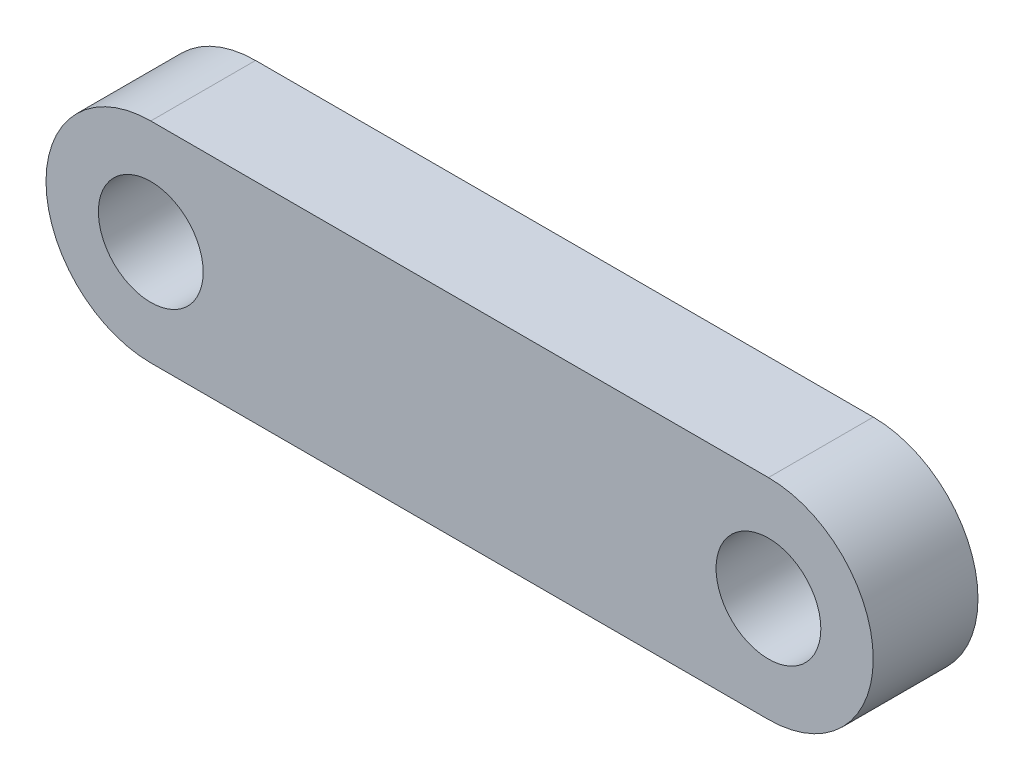
ISO-10303-21;
HEADER;
FILE_DESCRIPTION(('STEP AP214'),'2;1');
FILE_NAME('part.step','',(''),(''),'','','');
FILE_SCHEMA(('AUTOMOTIVE_DESIGN { 1 0 10303 214 1 1 1 1 }'));
ENDSEC;
DATA;
#1=APPLICATION_CONTEXT('core data for automotive mechanical design processes');
#2=APPLICATION_PROTOCOL_DEFINITION('international standard','automotive_design',2000,#1);
#3=PRODUCT_CONTEXT('',#1,'mechanical');
#4=PRODUCT('Part','Part','',(#3));
#5=PRODUCT_RELATED_PRODUCT_CATEGORY('part','',(#4));
#6=PRODUCT_DEFINITION_FORMATION('','',#4);
#7=PRODUCT_DEFINITION_CONTEXT('part definition',#1,'design');
#8=PRODUCT_DEFINITION('design','',#6,#7);
#9=PRODUCT_DEFINITION_SHAPE('','',#8);
#10=(LENGTH_UNIT() NAMED_UNIT(*) SI_UNIT(.MILLI.,.METRE.));
#11=(NAMED_UNIT(*) PLANE_ANGLE_UNIT() SI_UNIT($,.RADIAN.));
#12=(NAMED_UNIT(*) SI_UNIT($,.STERADIAN.) SOLID_ANGLE_UNIT());
#13=UNCERTAINTY_MEASURE_WITH_UNIT(LENGTH_MEASURE(1.E-05),#10,'distance_accuracy_value','');
#14=(GEOMETRIC_REPRESENTATION_CONTEXT(3) GLOBAL_UNCERTAINTY_ASSIGNED_CONTEXT((#13)) GLOBAL_UNIT_ASSIGNED_CONTEXT((#10,
#11,#12)) REPRESENTATION_CONTEXT('',''));
#15=CARTESIAN_POINT('',(0.,0.,0.));
#16=DIRECTION('',(0.,0.,1.));
#17=DIRECTION('',(1.,0.,0.));
#18=AXIS2_PLACEMENT_3D('',#15,#16,#17);
#19=CARTESIAN_POINT('',(-5.89499999215286,0.000304167366532138,2.));
#20=DIRECTION('',(0.,0.,1.));
#21=DIRECTION('',(1.,0.,0.));
#22=AXIS2_PLACEMENT_3D('',#19,#20,#21);
#23=PLANE('',#22);
#24=CARTESIAN_POINT('',(-5.89499999215286,0.000304167366532138,2.));
#25=DIRECTION('',(0.,0.,1.));
#26=DIRECTION('',(1.,0.,0.));
#27=AXIS2_PLACEMENT_3D('',#24,#25,#26);
#28=CIRCLE('',#27,1.);
#29=CARTESIAN_POINT('',(-4.89499999215286,0.000304167366532138,2.));
#30=VERTEX_POINT('',#29);
#31=EDGE_CURVE('E100',#30,#30,#28,.T.);
#32=ORIENTED_EDGE('',*,*,#31,.F.);
#33=EDGE_LOOP('',(#32));
#34=FACE_BOUND('',#33,.T.);
#35=CARTESIAN_POINT('',(-5.89499999215286,0.000304167366532138,2.));
#36=DIRECTION('',(0.,0.,1.));
#37=DIRECTION('',(1.,0.,0.));
#38=AXIS2_PLACEMENT_3D('',#35,#36,#37);
#39=CIRCLE('',#38,2.);
#40=CARTESIAN_POINT('',(-5.89499999215286,2.00030416736653,2.));
#41=VERTEX_POINT('',#40);
#42=CARTESIAN_POINT('',(-5.89499999215286,-1.99969583263347,2.));
#43=VERTEX_POINT('',#42);
#44=EDGE_CURVE('E85',#41,#43,#39,.T.);
#45=ORIENTED_EDGE('',*,*,#44,.T.);
#46=DIRECTION('',(1.,0.,0.));
#47=VECTOR('',#46,1.);
#48=CARTESIAN_POINT('',(-5.89499999215286,-1.99969583263347,2.));
#49=LINE('',#48,#47);
#50=CARTESIAN_POINT('',(5.89500000784714,-1.99969583263347,2.));
#51=VERTEX_POINT('',#50);
#52=EDGE_CURVE('E80',#43,#51,#49,.T.);
#53=ORIENTED_EDGE('',*,*,#52,.T.);
#54=CARTESIAN_POINT('',(5.89500000784714,0.000304167366532138,2.));
#55=DIRECTION('',(0.,0.,1.));
#56=DIRECTION('',(1.,0.,0.));
#57=AXIS2_PLACEMENT_3D('',#54,#55,#56);
#58=CIRCLE('',#57,2.);
#59=CARTESIAN_POINT('',(5.89500000784714,2.00030416736653,2.));
#60=VERTEX_POINT('',#59);
#61=EDGE_CURVE('E83',#51,#60,#58,.T.);
#62=ORIENTED_EDGE('',*,*,#61,.T.);
#63=DIRECTION('',(-1.,0.,0.));
#64=VECTOR('',#63,1.);
#65=CARTESIAN_POINT('',(-5.89499999215286,2.00030416736653,2.));
#66=LINE('',#65,#64);
#67=EDGE_CURVE('E50',#60,#41,#66,.T.);
#68=ORIENTED_EDGE('',*,*,#67,.T.);
#69=EDGE_LOOP('',(#45,#53,#62,#68));
#70=FACE_BOUND('',#69,.T.);
#71=CARTESIAN_POINT('',(5.89500000784714,0.000304167366532138,2.));
#72=DIRECTION('',(0.,0.,1.));
#73=DIRECTION('',(1.,0.,0.));
#74=AXIS2_PLACEMENT_3D('',#71,#72,#73);
#75=CIRCLE('',#74,1.);
#76=CARTESIAN_POINT('',(6.89500000784714,0.000304167366532138,2.));
#77=VERTEX_POINT('',#76);
#78=EDGE_CURVE('E115',#77,#77,#75,.T.);
#79=ORIENTED_EDGE('',*,*,#78,.F.);
#80=EDGE_LOOP('',(#79));
#81=FACE_BOUND('',#80,.T.);
#82=ADVANCED_FACE('F33',(#34,#70,#81),#23,.T.);
#83=CARTESIAN_POINT('',(-5.89499999215286,0.000304167366532138,0.));
#84=DIRECTION('',(0.,0.,1.));
#85=DIRECTION('',(1.,0.,0.));
#86=AXIS2_PLACEMENT_3D('',#83,#84,#85);
#87=PLANE('',#86);
#88=CARTESIAN_POINT('',(-5.89499999215286,0.000304167366532138,0.));
#89=DIRECTION('',(0.,0.,1.));
#90=DIRECTION('',(1.,0.,0.));
#91=AXIS2_PLACEMENT_3D('',#88,#89,#90);
#92=CIRCLE('',#91,2.);
#93=CARTESIAN_POINT('',(-5.89499999215286,2.00030416736653,0.));
#94=VERTEX_POINT('',#93);
#95=CARTESIAN_POINT('',(-5.89499999215286,-1.99969583263347,0.));
#96=VERTEX_POINT('',#95);
#97=EDGE_CURVE('E97',#94,#96,#92,.T.);
#98=ORIENTED_EDGE('',*,*,#97,.F.);
#99=DIRECTION('',(-1.,0.,0.));
#100=VECTOR('',#99,1.);
#101=CARTESIAN_POINT('',(-5.89499999215286,2.00030416736653,0.));
#102=LINE('',#101,#100);
#103=CARTESIAN_POINT('',(5.89500000784714,2.00030416736653,0.));
#104=VERTEX_POINT('',#103);
#105=EDGE_CURVE('E73',#104,#94,#102,.T.);
#106=ORIENTED_EDGE('',*,*,#105,.F.);
#107=CARTESIAN_POINT('',(5.89500000784714,0.000304167366532138,0.));
#108=DIRECTION('',(0.,0.,1.));
#109=DIRECTION('',(1.,0.,0.));
#110=AXIS2_PLACEMENT_3D('',#107,#108,#109);
#111=CIRCLE('',#110,2.);
#112=CARTESIAN_POINT('',(5.89500000784714,-1.99969583263347,0.));
#113=VERTEX_POINT('',#112);
#114=EDGE_CURVE('E67',#113,#104,#111,.T.);
#115=ORIENTED_EDGE('',*,*,#114,.F.);
#116=DIRECTION('',(1.,0.,0.));
#117=VECTOR('',#116,1.);
#118=CARTESIAN_POINT('',(-5.89499999215286,-1.99969583263347,0.));
#119=LINE('',#118,#117);
#120=EDGE_CURVE('E89',#96,#113,#119,.T.);
#121=ORIENTED_EDGE('',*,*,#120,.F.);
#122=EDGE_LOOP('',(#98,#106,#115,#121));
#123=FACE_BOUND('',#122,.T.);
#124=CARTESIAN_POINT('',(-5.89499999215286,0.000304167366532138,0.));
#125=DIRECTION('',(0.,0.,1.));
#126=DIRECTION('',(1.,0.,0.));
#127=AXIS2_PLACEMENT_3D('',#124,#125,#126);
#128=CIRCLE('',#127,1.);
#129=CARTESIAN_POINT('',(-4.89499999215286,0.000304167366532138,0.));
#130=VERTEX_POINT('',#129);
#131=EDGE_CURVE('E112',#130,#130,#128,.T.);
#132=ORIENTED_EDGE('',*,*,#131,.T.);
#133=EDGE_LOOP('',(#132));
#134=FACE_BOUND('',#133,.T.);
#135=CARTESIAN_POINT('',(5.89500000784714,0.000304167366532138,0.));
#136=DIRECTION('',(0.,0.,1.));
#137=DIRECTION('',(1.,0.,0.));
#138=AXIS2_PLACEMENT_3D('',#135,#136,#137);
#139=CIRCLE('',#138,1.);
#140=CARTESIAN_POINT('',(6.89500000784714,0.000304167366532138,0.));
#141=VERTEX_POINT('',#140);
#142=EDGE_CURVE('E118',#141,#141,#139,.T.);
#143=ORIENTED_EDGE('',*,*,#142,.T.);
#144=EDGE_LOOP('',(#143));
#145=FACE_BOUND('',#144,.T.);
#146=ADVANCED_FACE('F108',(#123,#134,#145),#87,.F.);
#147=CARTESIAN_POINT('',(-5.89499999215286,0.000304167366532138,2.));
#148=DIRECTION('',(0.,0.,-1.));
#149=DIRECTION('',(-1.,0.,0.));
#150=AXIS2_PLACEMENT_3D('',#147,#148,#149);
#151=CYLINDRICAL_SURFACE('',#150,2.);
#152=ORIENTED_EDGE('',*,*,#97,.T.);
#153=DIRECTION('',(0.,0.,-1.));
#154=VECTOR('',#153,1.);
#155=CARTESIAN_POINT('',(-5.89499999215286,-1.99969583263347,2.));
#156=LINE('',#155,#154);
#157=EDGE_CURVE('E11',#43,#96,#156,.T.);
#158=ORIENTED_EDGE('',*,*,#157,.F.);
#159=ORIENTED_EDGE('',*,*,#44,.F.);
#160=DIRECTION('',(0.,0.,-1.));
#161=VECTOR('',#160,1.);
#162=CARTESIAN_POINT('',(-5.89499999215286,2.00030416736653,2.));
#163=LINE('',#162,#161);
#164=EDGE_CURVE('E93',#41,#94,#163,.T.);
#165=ORIENTED_EDGE('',*,*,#164,.T.);
#166=EDGE_LOOP('',(#152,#158,#159,#165));
#167=FACE_BOUND('',#166,.T.);
#168=ADVANCED_FACE('F35',(#167),#151,.T.);
#169=CARTESIAN_POINT('',(-5.89499999215286,-1.99969583263347,2.));
#170=DIRECTION('',(0.,1.,0.));
#171=DIRECTION('',(0.,0.,1.));
#172=AXIS2_PLACEMENT_3D('',#169,#170,#171);
#173=PLANE('',#172);
#174=ORIENTED_EDGE('',*,*,#120,.T.);
#175=DIRECTION('',(0.,0.,-1.));
#176=VECTOR('',#175,1.);
#177=CARTESIAN_POINT('',(5.89500000784714,-1.99969583263347,2.));
#178=LINE('',#177,#176);
#179=EDGE_CURVE('E42',#51,#113,#178,.T.);
#180=ORIENTED_EDGE('',*,*,#179,.F.);
#181=ORIENTED_EDGE('',*,*,#52,.F.);
#182=ORIENTED_EDGE('',*,*,#157,.T.);
#183=EDGE_LOOP('',(#174,#180,#181,#182));
#184=FACE_BOUND('',#183,.T.);
#185=ADVANCED_FACE('F88',(#184),#173,.F.);
#186=CARTESIAN_POINT('',(5.89500000784714,0.000304167366532138,2.));
#187=DIRECTION('',(0.,0.,-1.));
#188=DIRECTION('',(-1.,0.,0.));
#189=AXIS2_PLACEMENT_3D('',#186,#187,#188);
#190=CYLINDRICAL_SURFACE('',#189,2.);
#191=ORIENTED_EDGE('',*,*,#114,.T.);
#192=DIRECTION('',(0.,0.,-1.));
#193=VECTOR('',#192,1.);
#194=CARTESIAN_POINT('',(5.89500000784714,2.00030416736653,2.));
#195=LINE('',#194,#193);
#196=EDGE_CURVE('E90',#60,#104,#195,.T.);
#197=ORIENTED_EDGE('',*,*,#196,.F.);
#198=ORIENTED_EDGE('',*,*,#61,.F.);
#199=ORIENTED_EDGE('',*,*,#179,.T.);
#200=EDGE_LOOP('',(#191,#197,#198,#199));
#201=FACE_BOUND('',#200,.T.);
#202=ADVANCED_FACE('F91',(#201),#190,.T.);
#203=CARTESIAN_POINT('',(-5.89499999215286,2.00030416736653,2.));
#204=DIRECTION('',(0.,-1.,0.));
#205=DIRECTION('',(0.,0.,-1.));
#206=AXIS2_PLACEMENT_3D('',#203,#204,#205);
#207=PLANE('',#206);
#208=ORIENTED_EDGE('',*,*,#105,.T.);
#209=ORIENTED_EDGE('',*,*,#164,.F.);
#210=ORIENTED_EDGE('',*,*,#67,.F.);
#211=ORIENTED_EDGE('',*,*,#196,.T.);
#212=EDGE_LOOP('',(#208,#209,#210,#211));
#213=FACE_BOUND('',#212,.T.);
#214=ADVANCED_FACE('F105',(#213),#207,.F.);
#215=CARTESIAN_POINT('',(-5.89499999215286,0.000304167366532138,2.));
#216=DIRECTION('',(0.,0.,-1.));
#217=DIRECTION('',(-1.,0.,0.));
#218=AXIS2_PLACEMENT_3D('',#215,#216,#217);
#219=CYLINDRICAL_SURFACE('',#218,1.);
#220=ORIENTED_EDGE('',*,*,#31,.T.);
#221=EDGE_LOOP('',(#220));
#222=FACE_BOUND('',#221,.T.);
#223=ORIENTED_EDGE('',*,*,#131,.F.);
#224=EDGE_LOOP('',(#223));
#225=FACE_BOUND('',#224,.T.);
#226=ADVANCED_FACE('F135',(#222,#225),#219,.F.);
#227=CARTESIAN_POINT('',(5.89500000784714,0.000304167366532138,2.));
#228=DIRECTION('',(0.,0.,-1.));
#229=DIRECTION('',(-1.,0.,0.));
#230=AXIS2_PLACEMENT_3D('',#227,#228,#229);
#231=CYLINDRICAL_SURFACE('',#230,1.);
#232=ORIENTED_EDGE('',*,*,#78,.T.);
#233=EDGE_LOOP('',(#232));
#234=FACE_BOUND('',#233,.T.);
#235=ORIENTED_EDGE('',*,*,#142,.F.);
#236=EDGE_LOOP('',(#235));
#237=FACE_BOUND('',#236,.T.);
#238=ADVANCED_FACE('F124',(#234,#237),#231,.F.);
#239=CLOSED_SHELL('',(#82,#146,#168,#185,#202,#214,#226,#238));
#240=MANIFOLD_SOLID_BREP('B2',#239);
#241=ADVANCED_BREP_SHAPE_REPRESENTATION('',(#18,#240),#14);
#242=SHAPE_DEFINITION_REPRESENTATION(#9,#241);
ENDSEC;
END-ISO-10303-21;
